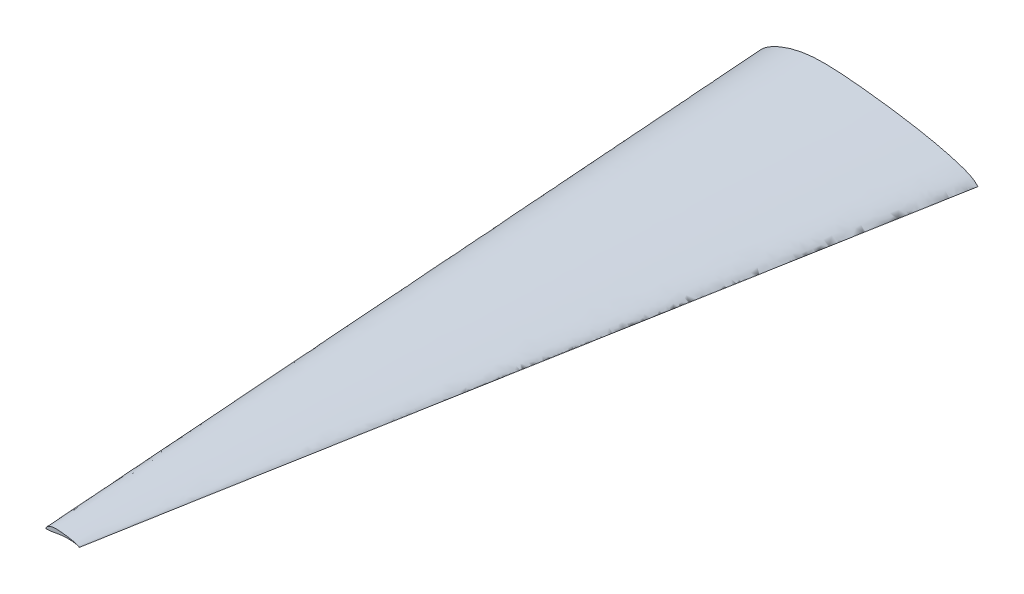
ISO-10303-21;
HEADER;
FILE_DESCRIPTION(('STEP AP214'),'2;1');
FILE_NAME('part.step','',(''),(''),'','','');
FILE_SCHEMA(('AUTOMOTIVE_DESIGN { 1 0 10303 214 1 1 1 1 }'));
ENDSEC;
DATA;
#1=APPLICATION_CONTEXT('core data for automotive mechanical design processes');
#2=APPLICATION_PROTOCOL_DEFINITION('international standard','automotive_design',2000,#1);
#3=PRODUCT_CONTEXT('',#1,'mechanical');
#4=PRODUCT('Part','Part','',(#3));
#5=PRODUCT_RELATED_PRODUCT_CATEGORY('part','',(#4));
#6=PRODUCT_DEFINITION_FORMATION('','',#4);
#7=PRODUCT_DEFINITION_CONTEXT('part definition',#1,'design');
#8=PRODUCT_DEFINITION('design','',#6,#7);
#9=PRODUCT_DEFINITION_SHAPE('','',#8);
#10=(LENGTH_UNIT() NAMED_UNIT(*) SI_UNIT(.MILLI.,.METRE.));
#11=(NAMED_UNIT(*) PLANE_ANGLE_UNIT() SI_UNIT($,.RADIAN.));
#12=(NAMED_UNIT(*) SI_UNIT($,.STERADIAN.) SOLID_ANGLE_UNIT());
#13=UNCERTAINTY_MEASURE_WITH_UNIT(LENGTH_MEASURE(1.E-05),#10,'distance_accuracy_value','');
#14=(GEOMETRIC_REPRESENTATION_CONTEXT(3) GLOBAL_UNCERTAINTY_ASSIGNED_CONTEXT((#13)) GLOBAL_UNIT_ASSIGNED_CONTEXT((#10,
#11,#12)) REPRESENTATION_CONTEXT('',''));
#15=CARTESIAN_POINT('',(0.,0.,0.));
#16=DIRECTION('',(0.,0.,1.));
#17=DIRECTION('',(1.,0.,0.));
#18=AXIS2_PLACEMENT_3D('',#15,#16,#17);
#19=CARTESIAN_POINT('',(61.3934433000788,15.0486940580988,700.));
#20=DIRECTION('',(0.,0.,-1.));
#21=DIRECTION('',(-1.,0.,0.));
#22=AXIS2_PLACEMENT_3D('',#19,#20,#21);
#23=PLANE('',#22);
#24=CARTESIAN_POINT('',(91.2130363063145,14.3931086109647,700.));
#25=CARTESIAN_POINT('',(91.21324777082,14.3937070477248,700.));
#26=CARTESIAN_POINT('',(91.1171588872662,14.4696717822711,700.));
#27=CARTESIAN_POINT('',(91.0299092592579,14.5466823701955,700.));
#28=CARTESIAN_POINT('',(90.8486599818489,14.7219848845493,700.));
#29=CARTESIAN_POINT('',(90.6287953381051,14.9033517737532,700.));
#30=CARTESIAN_POINT('',(90.3283270334837,15.0850215864156,700.));
#31=CARTESIAN_POINT('',(89.9556877544935,15.2609337907924,700.));
#32=CARTESIAN_POINT('',(89.5088815975822,15.4506157570831,700.));
#33=CARTESIAN_POINT('',(88.9834398649207,15.6400599648775,700.));
#34=CARTESIAN_POINT('',(88.3845527383798,15.833236344916,700.));
#35=CARTESIAN_POINT('',(87.715646345206,16.0313913324226,700.));
#36=CARTESIAN_POINT('',(86.9789001928267,16.2273748299646,700.));
#37=CARTESIAN_POINT('',(86.179025110034,16.425511204437,700.));
#38=CARTESIAN_POINT('',(85.3204682047619,16.6187060146178,700.));
#39=CARTESIAN_POINT('',(84.4092635510915,16.8101261846433,700.));
#40=CARTESIAN_POINT('',(83.4503830897707,16.9992179800215,700.));
#41=CARTESIAN_POINT('',(82.4492800856243,17.1812234875692,700.));
#42=CARTESIAN_POINT('',(81.4121564138775,17.355098747034,700.));
#43=CARTESIAN_POINT('',(80.3456655365122,17.5183064209802,700.));
#44=CARTESIAN_POINT('',(79.2570432271937,17.6782961809319,700.));
#45=CARTESIAN_POINT('',(78.1509003149223,17.8249886571486,700.));
#46=CARTESIAN_POINT('',(77.0374604534816,17.957733892098,700.));
#47=CARTESIAN_POINT('',(75.9246712186239,18.0849672558104,700.));
#48=CARTESIAN_POINT('',(74.8226331592671,18.1981955445727,700.));
#49=CARTESIAN_POINT('',(73.738830821218,18.2987015892319,700.));
#50=CARTESIAN_POINT('',(72.6827125020195,18.3765087647998,700.));
#51=CARTESIAN_POINT('',(71.6596105486563,18.4329230127722,700.));
#52=CARTESIAN_POINT('',(70.6751912426618,18.4560187789267,700.));
#53=CARTESIAN_POINT('',(69.7334387576005,18.4542650550733,700.));
#54=CARTESIAN_POINT('',(68.8370947860287,18.4073051855507,700.));
#55=CARTESIAN_POINT('',(67.9857147493561,18.3149993582483,700.));
#56=CARTESIAN_POINT('',(67.1773613447071,18.1781383929118,700.));
#57=CARTESIAN_POINT('',(66.4080599539051,18.0113957671084,700.));
#58=CARTESIAN_POINT('',(65.6811806153164,17.8112677307867,700.));
#59=CARTESIAN_POINT('',(64.9999810083022,17.5827973026956,700.));
#60=CARTESIAN_POINT('',(64.3676012105334,17.3356291742643,700.));
#61=CARTESIAN_POINT('',(63.7869425784885,17.0683337380131,700.));
#62=CARTESIAN_POINT('',(63.2604886925574,16.7872106804332,700.));
#63=CARTESIAN_POINT('',(62.7873782092871,16.4997930468596,700.));
#64=CARTESIAN_POINT('',(62.3802884168521,16.1966082171176,700.));
#65=CARTESIAN_POINT('',(62.0251940036743,15.9029263051531,700.));
#66=CARTESIAN_POINT('',(61.7434126632163,15.5954921326688,700.));
#67=CARTESIAN_POINT('',(61.5226604596598,15.2934807777064,700.));
#68=CARTESIAN_POINT('',(61.3606734659826,14.9977272468341,700.));
#69=CARTESIAN_POINT('',(61.2571235164279,14.7177640574113,700.));
#70=CARTESIAN_POINT('',(61.2085942817225,14.4592372482548,700.));
#71=CARTESIAN_POINT('',(61.2136576100944,14.2404123937173,700.));
#72=CARTESIAN_POINT('',(61.2710954743862,14.0390418648149,700.));
#73=CARTESIAN_POINT('',(61.4811417251508,13.9388468126618,700.));
#74=CARTESIAN_POINT('',(61.7638598062999,13.9259248086177,700.));
#75=CARTESIAN_POINT('',(62.1492216474276,13.9140862923358,700.));
#76=CARTESIAN_POINT('',(62.6335099169167,13.9331206717004,700.));
#77=CARTESIAN_POINT('',(63.2115853434654,13.9732883752448,700.));
#78=CARTESIAN_POINT('',(63.8766373579095,14.033970804828,700.));
#79=CARTESIAN_POINT('',(64.6233641712983,14.113224970745,700.));
#80=CARTESIAN_POINT('',(65.445502545613,14.2261194531111,700.));
#81=CARTESIAN_POINT('',(66.3467107739547,14.3680059621522,700.));
#82=CARTESIAN_POINT('',(67.3254841756791,14.5631362149076,700.));
#83=CARTESIAN_POINT('',(68.3922781552565,14.7597764383632,700.));
#84=CARTESIAN_POINT('',(69.537606817334,14.9799390723251,700.));
#85=CARTESIAN_POINT('',(70.7580442827832,15.1928994907078,700.));
#86=CARTESIAN_POINT('',(72.0420760142901,15.40858636786,700.));
#87=CARTESIAN_POINT('',(73.3814976953576,15.6042486409381,700.));
#88=CARTESIAN_POINT('',(74.7632035123,15.7853629438472,700.));
#89=CARTESIAN_POINT('',(76.175368059046,15.9385621080666,700.));
#90=CARTESIAN_POINT('',(77.6048720601698,16.0573000686217,700.));
#91=CARTESIAN_POINT('',(79.0371098437612,16.1451188464664,700.));
#92=CARTESIAN_POINT('',(80.4566309540897,16.1949760026972,700.));
#93=CARTESIAN_POINT('',(81.8482672054234,16.1961684310942,700.));
#94=CARTESIAN_POINT('',(83.1969841814247,16.1626215170868,700.));
#95=CARTESIAN_POINT('',(84.4877618893221,16.0852425670223,700.));
#96=CARTESIAN_POINT('',(85.7045998556663,15.9697989559649,700.));
#97=CARTESIAN_POINT('',(86.8328915309451,15.8193069435203,700.));
#98=CARTESIAN_POINT('',(87.857419113313,15.6345353310308,700.));
#99=CARTESIAN_POINT('',(88.7672630779213,15.4289953676254,700.));
#100=CARTESIAN_POINT('',(89.5431344271245,15.2023916547079,700.));
#101=CARTESIAN_POINT('',(90.1790092083944,14.9650882335364,700.));
#102=CARTESIAN_POINT('',(90.6353606447999,14.7516190363574,700.));
#103=CARTESIAN_POINT('',(90.9675691512524,14.5466954302776,700.));
#104=CARTESIAN_POINT('',(91.10010370813,14.4751358731456,700.));
#105=CARTESIAN_POINT('',(91.2128228608335,14.3925045681171,700.));
#106=CARTESIAN_POINT('',(91.2130363063145,14.3931086109647,700.));
#107=B_SPLINE_CURVE_WITH_KNOTS('',3,(#24,#25,#26,#27,#28,#29,#30,#31,#32,#33,#34,#35,#36,#37,
#38,#39,#40,#41,#42,#43,#44,#45,#46,#47,#48,#49,#50,#51,#52,#53,#54,#55,#56,#57,#58,#59,#60,#61,
#62,#63,#64,#65,#66,#67,#68,#69,#70,#71,#72,#73,#74,#75,#76,#77,#78,#79,#80,#81,#82,#83,#84,#85,
#86,#87,#88,#89,#90,#91,#92,#93,#94,#95,#96,#97,#98,#99,#100,#101,#102,#103,#104,#105,#106),
.UNSPECIFIED.,.T.,.F.,(4,1,1,1,1,1,1,1,1,1,1,1,1,1,1,1,1,1,1,1,1,1,1,1,1,1,1,1,1,1,1,1,1,1,1,1,
1,1,1,1,1,1,1,1,1,1,1,1,1,1,1,1,1,1,1,1,1,1,1,1,1,1,1,1,1,1,1,1,1,1,1,1,1,1,1,1,1,1,1,1,4),(0.,
0.000984069325414273,0.00362460441285257,0.00747484846823752,0.0120895553210187,
0.0175339949488162,0.0240666319187167,0.0317886904802936,0.0406833093178445,0.050721724418448,
0.0618229172496511,0.0739808538187179,0.0871095422898935,0.101156268909517,0.115985611118648,
0.131553824220598,0.147807781532484,0.164554316989685,0.181749362175214,0.19930789210954,
0.21707649580762,0.235010523017403,0.252833096127389,0.270540232696237,0.287891726811076,
0.304787604936839,0.321087687949416,0.336796939095176,0.351785836500767,0.366031168488221,
0.37962080182412,0.392639778004625,0.405148734367625,0.417181016306218,0.428607891605006,
0.43943107534858,0.449576174007455,0.459100587185074,0.46790987501459,0.475967799267961,
0.483314707132192,0.489868412405075,0.495817042410486,0.501135302922927,0.505906830544316,
0.510026945807495,0.51356219104174,0.516434198178689,0.519365104277622,0.523841204129446,
0.530000603275034,0.537737254159107,0.546970863894384,0.557658354601414,0.569613885695174,
0.582811814219211,0.59726713511665,0.613154365316021,0.630446138101288,0.64904864676311,
0.668825200026368,0.689581805144608,0.711197624688015,0.733436105811787,0.75609787094023,
0.778994652400443,0.801901283715063,0.824587970773231,0.846784505909869,0.868320327703238,
0.88897889114578,0.908495771545624,0.926655548522684,0.943293768335217,0.95818475087465,
0.971128514080188,0.981944748207558,0.990270942155145,0.995854435753888,0.999006712025269,1.),.UNSPECIFIED.);
#108=CARTESIAN_POINT('',(91.2130363063145,14.3931086109647,700.));
#109=VERTEX_POINT('',#108);
#110=EDGE_CURVE('E11',#109,#109,#107,.T.);
#111=ORIENTED_EDGE('',*,*,#110,.T.);
#112=EDGE_LOOP('',(#111));
#113=FACE_BOUND('',#112,.T.);
#114=ADVANCED_FACE('F47',(#113),#23,.F.);
#115=CARTESIAN_POINT('',(1.20271329176225,4.37056964756087,0.));
#116=DIRECTION('',(0.,0.,-1.));
#117=DIRECTION('',(-1.,0.,0.));
#118=AXIS2_PLACEMENT_3D('',#115,#116,#117);
#119=PLANE('',#118);
#120=CARTESIAN_POINT('',(200.,0.,0.));
#121=CARTESIAN_POINT('',(200.00140976337,0.00398957840104458,0.));
#122=CARTESIAN_POINT('',(199.360817206345,0.510421142043144,0.));
#123=CARTESIAN_POINT('',(198.779153019623,1.02382506153895,0.));
#124=CARTESIAN_POINT('',(197.570824503563,2.19250849056445,0.));
#125=CARTESIAN_POINT('',(196.105060211938,3.40162108525687,0.));
#126=CARTESIAN_POINT('',(194.101938181129,4.61275316967255,0.));
#127=CARTESIAN_POINT('',(191.617676321194,5.78550119885138,0.));
#128=CARTESIAN_POINT('',(188.638968608452,7.05004764078961,0.));
#129=CARTESIAN_POINT('',(185.136023724041,8.31300902608562,0.));
#130=CARTESIAN_POINT('',(181.143442880436,9.60085155967541,0.));
#131=CARTESIAN_POINT('',(176.684066925944,10.9218848097193,0.));
#132=CARTESIAN_POINT('',(171.772425910082,12.2284414599994,0.));
#133=CARTESIAN_POINT('',(166.43992535813,13.5493506231488,0.));
#134=CARTESIAN_POINT('',(160.716212656316,14.8373160243538,0.));
#135=CARTESIAN_POINT('',(154.64151496518,16.1134504911911,0.));
#136=CARTESIAN_POINT('',(148.248978556375,17.3740624603791,0.));
#137=CARTESIAN_POINT('',(141.574958528732,18.587432510697,0.));
#138=CARTESIAN_POINT('',(134.660800717087,19.7466009071288,0.));
#139=CARTESIAN_POINT('',(127.550861534652,20.8346520667699,0.));
#140=CARTESIAN_POINT('',(120.293379472528,21.9012504664484,0.));
#141=CARTESIAN_POINT('',(112.919093390719,22.8792003078925,0.));
#142=CARTESIAN_POINT('',(105.496160981114,23.764168540889,0.));
#143=CARTESIAN_POINT('',(98.0775660820632,24.6123909656379,0.));
#144=CARTESIAN_POINT('',(90.7306456863513,25.3672462240534,0.));
#145=CARTESIAN_POINT('',(83.5052967660236,26.0372865217814,0.));
#146=CARTESIAN_POINT('',(76.464507971367,26.5560010255673,0.));
#147=CARTESIAN_POINT('',(69.643828282279,26.9320960120501,0.));
#148=CARTESIAN_POINT('',(63.0810329089826,27.0860677864131,0.));
#149=CARTESIAN_POINT('',(56.8026830085738,27.0743762940575,0.));
#150=CARTESIAN_POINT('',(50.8270565314283,26.7613104972403,0.));
#151=CARTESIAN_POINT('',(45.1511896202776,26.1459383152241,0.));
#152=CARTESIAN_POINT('',(39.762166922618,25.2335318796476,0.));
#153=CARTESIAN_POINT('',(34.6334909839375,24.1219143742914,0.));
#154=CARTESIAN_POINT('',(29.7876287266793,22.7877274654803,0.));
#155=CARTESIAN_POINT('',(25.2462980132514,21.264591278206,0.));
#156=CARTESIAN_POINT('',(21.0304326947931,19.6168037553305,0.));
#157=CARTESIAN_POINT('',(17.1593751478271,17.8348341803229,0.));
#158=CARTESIAN_POINT('',(13.6496825749533,15.9606804631237,0.));
#159=CARTESIAN_POINT('',(10.4956126864845,14.0445629059659,0.));
#160=CARTESIAN_POINT('',(7.78168073691762,12.0233307076863,0.));
#161=CARTESIAN_POINT('',(5.41438464906599,10.0654512945894,0.));
#162=CARTESIAN_POINT('',(3.53584237934547,8.0158901446942,0.));
#163=CARTESIAN_POINT('',(2.06416102230251,6.00248111161142,0.));
#164=CARTESIAN_POINT('',(0.984247731120862,4.03079090579629,0.));
#165=CARTESIAN_POINT('',(0.293914734089971,2.16436964297742,0.));
#166=CARTESIAN_POINT('',(-0.0296134972796619,0.440857581933844,0.));
#167=CARTESIAN_POINT('',(0.00414202519993184,-1.01797478164939,0.));
#168=CARTESIAN_POINT('',(0.387061120478284,-2.36044497433198,0.));
#169=CARTESIAN_POINT('',(1.78736945890929,-3.02841198868592,0.));
#170=CARTESIAN_POINT('',(3.67215666656998,-3.11455868231303,0.));
#171=CARTESIAN_POINT('',(6.24123560742074,-3.19348212419229,0.));
#172=CARTESIAN_POINT('',(9.46982407068137,-3.06658626176198,0.));
#173=CARTESIAN_POINT('',(13.3236602476728,-2.79880157146587,0.));
#174=CARTESIAN_POINT('',(17.7573403439669,-2.39425204091121,0.));
#175=CARTESIAN_POINT('',(22.7355190998924,-1.86589093479815,0.));
#176=CARTESIAN_POINT('',(28.216441595324,-1.1132610523572,0.));
#177=CARTESIAN_POINT('',(34.224496450935,-0.167350992083212,0.));
#178=CARTESIAN_POINT('',(40.7496524624311,1.13351735961941,0.));
#179=CARTESIAN_POINT('',(47.8616123262806,2.44445218265715,0.));
#180=CARTESIAN_POINT('',(55.4971367401303,3.9122030757362,0.));
#181=CARTESIAN_POINT('',(63.6333865097914,5.33193919828737,0.));
#182=CARTESIAN_POINT('',(72.1935980531712,6.76985171263529,0.));
#183=CARTESIAN_POINT('',(81.1230759269542,8.07426686648972,0.));
#184=CARTESIAN_POINT('',(90.3344480399034,9.28169555254991,0.));
#185=CARTESIAN_POINT('',(99.7488783515434,10.3030233140128,0.));
#186=CARTESIAN_POINT('',(109.278905025702,11.0946097177133,0.));
#187=CARTESIAN_POINT('',(118.827156916312,11.6800682366783,0.));
#188=CARTESIAN_POINT('',(128.290630985169,12.012449278217,0.));
#189=CARTESIAN_POINT('',(137.56820599406,12.0203988008638,0.));
#190=CARTESIAN_POINT('',(146.559652500735,11.7967527074806,0.));
#191=CARTESIAN_POINT('',(155.164837220051,11.2808930403844,0.));
#192=CARTESIAN_POINT('',(163.277090329012,10.5112689666682,0.));
#193=CARTESIAN_POINT('',(170.799034830871,9.50798888370421,0.));
#194=CARTESIAN_POINT('',(177.629218713324,8.27617813377405,0.));
#195=CARTESIAN_POINT('',(183.694845144046,6.90591171107133,0.));
#196=CARTESIAN_POINT('',(188.8673208054,5.39522029162144,0.));
#197=CARTESIAN_POINT('',(193.106486013866,3.81319748381123,0.));
#198=CARTESIAN_POINT('',(196.148828923236,2.39006950261799,0.));
#199=CARTESIAN_POINT('',(198.363552299586,1.02391212875292,0.));
#200=CARTESIAN_POINT('',(199.247116012103,0.546848414539277,0.));
#201=CARTESIAN_POINT('',(199.998577030127,-0.00402695231694919,0.));
#202=CARTESIAN_POINT('',(200.,0.,0.));
#203=B_SPLINE_CURVE_WITH_KNOTS('',3,(#120,#121,#122,#123,#124,#125,#126,#127,#128,#129,#130,
#131,#132,#133,#134,#135,#136,#137,#138,#139,#140,#141,#142,#143,#144,#145,#146,#147,#148,#149,
#150,#151,#152,#153,#154,#155,#156,#157,#158,#159,#160,#161,#162,#163,#164,#165,#166,#167,#168,
#169,#170,#171,#172,#173,#174,#175,#176,#177,#178,#179,#180,#181,#182,#183,#184,#185,#186,#187,
#188,#189,#190,#191,#192,#193,#194,#195,#196,#197,#198,#199,#200,#201,#202),.UNSPECIFIED.,.T.,
.F.,(4,1,1,1,1,1,1,1,1,1,1,1,1,1,1,1,1,1,1,1,1,1,1,1,1,1,1,1,1,1,1,1,1,1,1,1,1,1,1,1,1,1,1,1,1,
1,1,1,1,1,1,1,1,1,1,1,1,1,1,1,1,1,1,1,1,1,1,1,1,1,1,1,1,1,1,1,1,1,1,1,4),(0.,
0.000984069325414273,0.00362460441285257,0.00747484846823752,0.0120895553210187,
0.0175339949488162,0.0240666319187167,0.0317886904802936,0.0406833093178445,0.050721724418448,
0.0618229172496511,0.0739808538187179,0.0871095422898935,0.101156268909517,0.115985611118648,
0.131553824220598,0.147807781532484,0.164554316989685,0.181749362175214,0.19930789210954,
0.21707649580762,0.235010523017403,0.252833096127389,0.270540232696237,0.287891726811076,
0.304787604936839,0.321087687949416,0.336796939095176,0.351785836500767,0.366031168488221,
0.37962080182412,0.392639778004625,0.405148734367625,0.417181016306218,0.428607891605006,
0.43943107534858,0.449576174007455,0.459100587185074,0.46790987501459,0.475967799267961,
0.483314707132192,0.489868412405075,0.495817042410486,0.501135302922927,0.505906830544316,
0.510026945807495,0.51356219104174,0.516434198178689,0.519365104277622,0.523841204129446,
0.530000603275034,0.537737254159107,0.546970863894384,0.557658354601414,0.569613885695174,
0.582811814219211,0.59726713511665,0.613154365316021,0.630446138101288,0.64904864676311,
0.668825200026368,0.689581805144608,0.711197624688015,0.733436105811787,0.75609787094023,
0.778994652400443,0.801901283715063,0.824587970773231,0.846784505909869,0.868320327703238,
0.88897889114578,0.908495771545624,0.926655548522684,0.943293768335217,0.95818475087465,
0.971128514080188,0.981944748207558,0.990270942155145,0.995854435753888,0.999006712025269,1.),.UNSPECIFIED.);
#204=CARTESIAN_POINT('',(200.,0.,0.));
#205=VERTEX_POINT('',#204);
#206=EDGE_CURVE('E57',#205,#205,#203,.T.);
#207=ORIENTED_EDGE('',*,*,#206,.F.);
#208=EDGE_LOOP('',(#207));
#209=FACE_BOUND('',#208,.T.);
#210=ADVANCED_FACE('F85',(#209),#119,.T.);
#211=CARTESIAN_POINT('',(0.365556474131087,-2.01566691091643,0.));
#212=CARTESIAN_POINT('',(61.2193100720595,14.2645392880292,700.));
#213=CARTESIAN_POINT('',(0.407839734051821,-2.09059734356018,0.));
#214=CARTESIAN_POINT('',(61.2208910206036,14.2514370421515,700.));
#215=CARTESIAN_POINT('',(0.458597361293128,-2.1661301890592,0.));
#216=CARTESIAN_POINT('',(61.2229150966544,14.2374505165738,700.));
#217=CARTESIAN_POINT('',(0.764211764323133,-2.53406198353965,0.));
#218=CARTESIAN_POINT('',(61.2356485520285,14.1633146871273,700.));
#219=CARTESIAN_POINT('',(1.16411702152294,-2.73111170248164,0.));
#220=CARTESIAN_POINT('',(61.2542148461988,14.099491149684,700.));
#221=CARTESIAN_POINT('',(1.95514728916004,-2.97641309916418,0.));
#222=CARTESIAN_POINT('',(61.3318045452048,14.0100827736876,700.));
#223=CARTESIAN_POINT('',(2.5880126874233,-3.06500644700518,0.));
#224=CARTESIAN_POINT('',(61.4253171584128,13.9660250257584,700.));
#225=CARTESIAN_POINT('',(3.60509159952578,-3.10741547885142,0.));
#226=CARTESIAN_POINT('',(61.5764829074494,13.9344891177516,700.));
#227=CARTESIAN_POINT('',(4.69408843562274,-3.14595295801898,0.));
#228=CARTESIAN_POINT('',(61.7392682661551,13.9274279803402,700.));
#229=CARTESIAN_POINT('',(5.95094894153947,-3.16665329831216,0.));
#230=CARTESIAN_POINT('',(61.9275407598012,13.920896444555,700.));
#231=CARTESIAN_POINT('',(7.49631352842752,-3.14415276648203,0.));
#232=CARTESIAN_POINT('',(62.1595138847883,13.917654398297,700.));
#233=CARTESIAN_POINT('',(8.97112007172186,-3.07877003355681,0.));
#234=CARTESIAN_POINT('',(62.3808804800977,13.9231913695842,700.));
#235=CARTESIAN_POINT('',(10.9424617389554,-2.96425969576223,0.));
#236=CARTESIAN_POINT('',(62.6767560831729,13.9373980544448,700.));
#237=CARTESIAN_POINT('',(12.6232546153333,-2.84227821376786,0.));
#238=CARTESIAN_POINT('',(62.9290141083511,13.9536538481901,700.));
#239=CARTESIAN_POINT('',(15.0018504469956,-2.64567571606531,0.));
#240=CARTESIAN_POINT('',(63.2859867505901,13.980951191973,700.));
#241=CARTESIAN_POINT('',(16.8819338831208,-2.47063092775345,0.));
#242=CARTESIAN_POINT('',(63.5681205415646,14.0058202999405,700.));
#243=CARTESIAN_POINT('',(19.6351487540702,-2.19495005171494,0.));
#244=CARTESIAN_POINT('',(63.9812457407384,14.045648045976,700.));
#245=CARTESIAN_POINT('',(21.6882177432614,-1.96986270058142,0.));
#246=CARTESIAN_POINT('',(64.2893892957794,14.077778406189,700.));
#247=CARTESIAN_POINT('',(24.7817650820978,-1.58490431725043,0.));
#248=CARTESIAN_POINT('',(64.7538134042727,14.1323105385053,700.));
#249=CARTESIAN_POINT('',(26.9992915801037,-1.27583956740147,0.));
#250=CARTESIAN_POINT('',(65.0866788419077,14.1768464626315,700.));
#251=CARTESIAN_POINT('',(30.4283760190949,-0.765013395770438,0.));
#252=CARTESIAN_POINT('',(65.6013378924406,14.251393661038,700.));
#253=CARTESIAN_POINT('',(32.8121961557572,-0.380438289279744,0.));
#254=CARTESIAN_POINT('',(65.9592569884123,14.3070051153817,700.));
#255=CARTESIAN_POINT('',(36.59258845096,0.304756637424069,0.));
#256=CARTESIAN_POINT('',(66.5270888051045,14.4054824954333,700.));
#257=CARTESIAN_POINT('',(39.1574067279642,0.812784869364103,0.));
#258=CARTESIAN_POINT('',(66.9119879558398,14.4807007689213,700.));
#259=CARTESIAN_POINT('',(43.3206552132522,1.60742569159822,0.));
#260=CARTESIAN_POINT('',(67.5361945371838,14.601445474149,700.));
#261=CARTESIAN_POINT('',(46.084262842406,2.11855653013369,0.));
#262=CARTESIAN_POINT('',(67.9506880331788,14.6783789221197,700.));
#263=CARTESIAN_POINT('',(50.6216850620048,2.97501157887547,0.));
#264=CARTESIAN_POINT('',(68.6314506047755,14.8060269306993,700.));
#265=CARTESIAN_POINT('',(53.5622137788093,3.53640080082807,0.));
#266=CARTESIAN_POINT('',(69.0724759567318,14.8905285486931,700.));
#267=CARTESIAN_POINT('',(58.4462285351526,4.42680529034924,0.));
#268=CARTESIAN_POINT('',(69.8047387553728,15.0259437191634,700.));
#269=CARTESIAN_POINT('',(61.5570908304384,4.96821734003042,0.));
#270=CARTESIAN_POINT('',(70.2712244322671,15.1079517879554,700.));
#271=CARTESIAN_POINT('',(66.7474199033669,5.855022952004,0.));
#272=CARTESIAN_POINT('',(71.0496546274865,15.2416613831053,700.));
#273=CARTESIAN_POINT('',(69.997178787775,6.39613437035021,0.));
#274=CARTESIAN_POINT('',(71.5369707622046,15.3237406652327,700.));
#275=CARTESIAN_POINT('',(75.4536347090481,7.24607678157598,0.));
#276=CARTESIAN_POINT('',(72.3550689719684,15.453569063388,700.));
#277=CARTESIAN_POINT('',(78.8328594599207,7.73643341009386,0.));
#278=CARTESIAN_POINT('',(72.861772044916,15.5283272910154,700.));
#279=CARTESIAN_POINT('',(84.5086934319408,8.51805435497926,0.));
#280=CARTESIAN_POINT('',(73.7129249825548,15.6471887829105,700.));
#281=CARTESIAN_POINT('',(87.9811378702275,8.96826178169618,0.));
#282=CARTESIAN_POINT('',(74.2336339686749,15.7159468513914,700.));
#283=CARTESIAN_POINT('',(93.8157848889768,9.65936959689079,0.));
#284=CARTESIAN_POINT('',(75.1085296714449,15.8220710677687,700.));
#285=CARTESIAN_POINT('',(97.3564279042289,10.0378694859698,0.));
#286=CARTESIAN_POINT('',(75.639455597289,15.880423457422,700.));
#287=CARTESIAN_POINT('',(103.297488936841,10.5977792457004,0.));
#288=CARTESIAN_POINT('',(76.5303492266301,15.9672007547567,700.));
#289=CARTESIAN_POINT('',(106.879155413429,10.890458054458,0.));
#290=CARTESIAN_POINT('',(77.0674678413473,16.0126620117247,700.));
#291=CARTESIAN_POINT('',(112.8657720348,11.3145412686327,0.));
#292=CARTESIAN_POINT('',(77.9652886058042,16.0786767085367,700.));
#293=CARTESIAN_POINT('',(116.454315128418,11.528729669944,0.));
#294=CARTESIAN_POINT('',(78.5034732031444,16.1123984992384,700.));
#295=CARTESIAN_POINT('',(122.420273744031,11.8062675483558,0.));
#296=CARTESIAN_POINT('',(79.3982160222823,16.1569335900655,700.));
#297=CARTESIAN_POINT('',(125.982818832059,11.9236864036968,0.));
#298=CARTESIAN_POINT('',(79.9325328604266,16.1765683577909,700.));
#299=CARTESIAN_POINT('',(131.855143700262,12.0155035434239,0.));
#300=CARTESIAN_POINT('',(80.8133160819738,16.1941484966792,700.));
#301=CARTESIAN_POINT('',(135.351119427058,12.0126757526868,0.));
#302=CARTESIAN_POINT('',(81.337703650697,16.1957309529238,700.));
#303=CARTESIAN_POINT('',(141.063151045773,11.9334683156716,0.));
#304=CARTESIAN_POINT('',(82.1945433800248,16.1867047241304,700.));
#305=CARTESIAN_POINT('',(144.465515001577,11.8408415328,0.));
#306=CARTESIAN_POINT('',(82.7049564147154,16.1748598246582,700.));
#307=CARTESIAN_POINT('',(149.95756695864,11.5930560898889,0.));
#308=CARTESIAN_POINT('',(83.5289193428872,16.1415645296055,700.));
#309=CARTESIAN_POINT('',(153.23252493973,11.3886884166711,0.));
#310=CARTESIAN_POINT('',(84.0203037126602,16.113265535414,700.));
#311=CARTESIAN_POINT('',(158.431498217747,10.9709790238063,0.));
#312=CARTESIAN_POINT('',(84.8004497872271,16.054426495704,700.));
#313=CARTESIAN_POINT('',(161.538427836111,10.667260295796,0.));
#314=CARTESIAN_POINT('',(85.2667239035977,16.0113410367514,700.));
#315=CARTESIAN_POINT('',(166.372136133826,10.0984504712561,0.));
#316=CARTESIAN_POINT('',(85.9922319152175,15.9301670255263,700.));
#317=CARTESIAN_POINT('',(169.277481799134,9.69990466227899,0.));
#318=CARTESIAN_POINT('',(86.4284335393642,15.8732537184863,700.));
#319=CARTESIAN_POINT('',(173.684537691477,8.98759389817815,0.));
#320=CARTESIAN_POINT('',(87.0902950206995,15.7713387034393,700.));
#321=CARTESIAN_POINT('',(176.359018576502,8.4943895173178,0.));
#322=CARTESIAN_POINT('',(87.4919923329297,15.7004393599904,700.));
#323=CARTESIAN_POINT('',(180.284743798801,7.67627688683218,0.));
#324=CARTESIAN_POINT('',(88.0816782689236,15.5823782751187,700.));
#325=CARTESIAN_POINT('',(182.697341684361,7.11529008781067,0.));
#326=CARTESIAN_POINT('',(88.444516840444,15.5019059461649,700.));
#327=CARTESIAN_POINT('',(186.066626985439,6.21320077124604,0.));
#328=CARTESIAN_POINT('',(88.9518662647368,15.3729071069974,700.));
#329=CARTESIAN_POINT('',(188.174611738587,5.57738079135047,0.));
#330=CARTESIAN_POINT('',(89.269162762788,15.2824087818213,700.));
#331=CARTESIAN_POINT('',(190.951583875693,4.61738985743713,0.));
#332=CARTESIAN_POINT('',(89.6869861087203,15.1460580796463,700.));
#333=CARTESIAN_POINT('',(192.736437165936,3.92779855292821,0.));
#334=CARTESIAN_POINT('',(89.9578793887495,15.0476121270299,700.));
#335=CARTESIAN_POINT('',(194.785800813227,3.02765819669094,0.));
#336=CARTESIAN_POINT('',(90.271853685707,14.9185638162442,700.));
#337=CARTESIAN_POINT('',(196.174096520333,2.33428816582804,0.));
#338=CARTESIAN_POINT('',(90.4800409635651,14.8242734974027,700.));
#339=CARTESIAN_POINT('',(197.597215034485,1.49662909050329,0.));
#340=CARTESIAN_POINT('',(90.6889333767725,14.7138582631029,700.));
#341=CARTESIAN_POINT('',(198.583220527401,0.90746754846199,0.));
#342=CARTESIAN_POINT('',(90.8510510721409,14.6185698840656,700.));
#343=CARTESIAN_POINT('',(199.127822002493,0.611258985618595,0.));
#344=CARTESIAN_POINT('',(90.9551269911782,14.5563189067865,700.));
#345=CARTESIAN_POINT('',(199.760468827546,0.170523610257043,0.));
#346=CARTESIAN_POINT('',(91.019459637047,14.5195708876863,700.));
#347=CARTESIAN_POINT('',(200.176957991844,-0.134793120313965,0.));
#348=CARTESIAN_POINT('',(91.054303728121,14.4997183058557,700.));
#349=CARTESIAN_POINT('',(199.676446083036,0.26089525573649,0.));
#350=CARTESIAN_POINT('',(91.1027020176481,14.4699096709233,700.));
#351=CARTESIAN_POINT('',(199.318043532939,0.554530460599907,0.));
#352=CARTESIAN_POINT('',(91.1625770827747,14.4293383635599,700.));
#353=CARTESIAN_POINT('',(199.066396818694,0.772528507300002,0.));
#354=CARTESIAN_POINT('',(91.2343740349072,14.3767059962162,700.));
#355=CARTESIAN_POINT('',(198.89508130081,0.928918040306746,0.));
#356=CARTESIAN_POINT('',(91.1922356735875,14.4103185258636,700.));
#357=CARTESIAN_POINT('',(198.564021541997,1.23567419277827,0.));
#358=CARTESIAN_POINT('',(91.1079072614292,14.4778376984043,700.));
#359=CARTESIAN_POINT('',(198.163103035796,1.61870207217614,0.));
#360=CARTESIAN_POINT('',(91.0629655662228,14.5175053330885,700.));
#361=CARTESIAN_POINT('',(197.464313945275,2.26200366027174,0.));
#362=CARTESIAN_POINT('',(90.9701954202691,14.6044370066062,700.));
#363=CARTESIAN_POINT('',(196.866653197597,2.77338114500734,0.));
#364=CARTESIAN_POINT('',(90.8786098480173,14.6914936926101,700.));
#365=CARTESIAN_POINT('',(196.049741232388,3.39149855043674,0.));
#366=CARTESIAN_POINT('',(90.7596203582033,14.7954338906356,700.));
#367=CARTESIAN_POINT('',(195.20602116668,3.94520006652073,0.));
#368=CARTESIAN_POINT('',(90.6424322829916,14.8869932577611,700.));
#369=CARTESIAN_POINT('',(194.196279283943,4.52299949372626,0.));
#370=CARTESIAN_POINT('',(90.4979155766285,14.9824845853778,700.));
#371=CARTESIAN_POINT('',(193.058194818833,5.10547416291476,0.));
#372=CARTESIAN_POINT('',(90.3306932546007,15.0785893268679,700.));
#373=CARTESIAN_POINT('',(191.872449336546,5.65384878952426,0.));
#374=CARTESIAN_POINT('',(90.1553339054701,15.1666866287412,700.));
#375=CARTESIAN_POINT('',(190.412694011966,6.29705058156346,0.));
#376=CARTESIAN_POINT('',(89.9381158538658,15.2665078409199,700.));
#377=CARTESIAN_POINT('',(189.049729086269,6.86054275650451,0.));
#378=CARTESIAN_POINT('',(89.7352176825422,15.3545296289632,700.));
#379=CARTESIAN_POINT('',(187.251981000067,7.55011596874687,0.));
#380=CARTESIAN_POINT('',(89.467489291317,15.4630712192575,700.));
#381=CARTESIAN_POINT('',(185.708237756799,8.09784450274057,0.));
#382=CARTESIAN_POINT('',(89.2371494644284,15.5485868079109,700.));
#383=CARTESIAN_POINT('',(183.577153196177,8.81583660773847,0.));
#384=CARTESIAN_POINT('',(88.9185827602388,15.6595387218033,700.));
#385=CARTESIAN_POINT('',(181.864524661325,9.36218215853146,0.));
#386=CARTESIAN_POINT('',(88.6623827442371,15.7436198004636,700.));
#387=CARTESIAN_POINT('',(179.419771739977,10.1114671507186,0.));
#388=CARTESIAN_POINT('',(88.2963987487957,15.8583711498277,700.));
#389=CARTESIAN_POINT('',(177.551977720138,10.6578560134141,0.));
#390=CARTESIAN_POINT('',(88.0167755752039,15.9421856387455,700.));
#391=CARTESIAN_POINT('',(174.803359536527,11.4221760034238,0.));
#392=CARTESIAN_POINT('',(87.6052702620593,16.0596445200318,700.));
#393=CARTESIAN_POINT('',(172.779019274675,11.9565095173818,0.));
#394=CARTESIAN_POINT('',(87.3020571171192,16.1414111312425,700.));
#395=CARTESIAN_POINT('',(169.740210552769,12.7318397926982,0.));
#396=CARTESIAN_POINT('',(86.8466821536015,16.2594640171663,700.));
#397=CARTESIAN_POINT('',(167.575238342216,13.2629814261913,0.));
#398=CARTESIAN_POINT('',(86.5222674660245,16.3404869332172,700.));
#399=CARTESIAN_POINT('',(164.265067146817,14.0387431336798,0.));
#400=CARTESIAN_POINT('',(86.0262680262032,16.4590735275388,700.));
#401=CARTESIAN_POINT('',(161.964422355685,14.5530581597184,0.));
#402=CARTESIAN_POINT('',(85.6814574755991,16.5374752269688,700.));
#403=CARTESIAN_POINT('',(158.409208179662,15.3219570842872,0.));
#404=CARTESIAN_POINT('',(85.1484954674032,16.6543037207733,700.));
#405=CARTESIAN_POINT('',(155.994665184252,15.8262866752742,0.));
#406=CARTESIAN_POINT('',(84.7865080118234,16.7308770296663,700.));
#407=CARTESIAN_POINT('',(152.221426906286,16.5906932909862,0.));
#408=CARTESIAN_POINT('',(84.2207890157079,16.8468410335808,700.));
#409=CARTESIAN_POINT('',(149.699460247365,17.0845623210221,0.));
#410=CARTESIAN_POINT('',(83.8426779983853,16.9218571914979,700.));
#411=CARTESIAN_POINT('',(145.720531815125,17.8337466592501,0.));
#412=CARTESIAN_POINT('',(83.2461379407794,17.0358132710431,700.));
#413=CARTESIAN_POINT('',(143.097312939447,18.3074677024591,0.));
#414=CARTESIAN_POINT('',(82.8528347945903,17.1078552334291,700.));
#415=CARTESIAN_POINT('',(138.945973535623,19.0281855860134,0.));
#416=CARTESIAN_POINT('',(82.2303905592392,17.2174304650703,700.));
#417=CARTESIAN_POINT('',(136.248628451521,19.4771023433204,0.));
#418=CARTESIAN_POINT('',(81.8259486105123,17.2857258964142,700.));
#419=CARTESIAN_POINT('',(131.957851347694,20.160239775248,0.));
#420=CARTESIAN_POINT('',(81.1825752398284,17.3897273758784,700.));
#421=CARTESIAN_POINT('',(129.192782086167,20.5820168549648,0.));
#422=CARTESIAN_POINT('',(80.7679231427551,17.4536873199793,700.));
#423=CARTESIAN_POINT('',(124.783536960818,21.2413528944917,0.));
#424=CARTESIAN_POINT('',(80.1066320502201,17.5532273000871,700.));
#425=CARTESIAN_POINT('',(121.965535388403,21.6522539891109,0.));
#426=CARTESIAN_POINT('',(79.6840300071467,17.6155439188825,700.));
#427=CARTESIAN_POINT('',(117.470204131268,22.2756492688172,0.));
#428=CARTESIAN_POINT('',(79.0099458908588,17.7105741296669,700.));
#429=CARTESIAN_POINT('',(114.617573938093,22.6509186613041,0.));
#430=CARTESIAN_POINT('',(78.5821750501532,17.7677946380586,700.));
#431=CARTESIAN_POINT('',(110.062179784112,23.2198039462863,0.));
#432=CARTESIAN_POINT('',(77.8990425814556,17.8545570985396,700.));
#433=CARTESIAN_POINT('',(107.182196268653,23.5620434895155,0.));
#434=CARTESIAN_POINT('',(77.4671201748176,17.9065094994458,700.));
#435=CARTESIAN_POINT('',(102.614680050159,24.0936294125745,0.));
#436=CARTESIAN_POINT('',(76.7820540057567,17.986770201292,700.));
#437=CARTESIAN_POINT('',(99.7483793256728,24.418702985155,0.));
#438=CARTESIAN_POINT('',(76.3521708776212,18.0360880809439,700.));
#439=CARTESIAN_POINT('',(95.2079737048016,24.9072256417763,0.));
#440=CARTESIAN_POINT('',(75.6712454324766,18.1106103183102,700.));
#441=CARTESIAN_POINT('',(92.3541900401649,25.1981264403768,0.));
#442=CARTESIAN_POINT('',(75.2432547850755,18.1549790090798,700.));
#443=CARTESIAN_POINT('',(87.8742540741855,25.6321327378186,0.));
#444=CARTESIAN_POINT('',(74.5713722677294,18.221156032606,700.));
#445=CARTESIAN_POINT('',(85.066954737416,25.8880352038385,0.));
#446=CARTESIAN_POINT('',(74.1503662234228,18.2605379923649,700.));
#447=CARTESIAN_POINT('',(80.6939244909322,26.2444081408446,0.));
#448=CARTESIAN_POINT('',(73.4945831318721,18.316047303781,700.));
#449=CARTESIAN_POINT('',(77.9457179351452,26.4425261371851,0.));
#450=CARTESIAN_POINT('',(73.0824505801081,18.3470589481858,700.));
#451=CARTESIAN_POINT('',(73.7131134556263,26.7077140117176,0.));
#452=CARTESIAN_POINT('',(72.4476972007054,18.3888356052315,700.));
#453=CARTESIAN_POINT('',(71.0445219875005,26.8473733270866,0.));
#454=CARTESIAN_POINT('',(72.0474953704027,18.4115348896758,700.));
#455=CARTESIAN_POINT('',(66.9722396478323,26.9947749802361,0.));
#456=CARTESIAN_POINT('',(71.4367861148383,18.4370636096023,700.));
#457=CARTESIAN_POINT('',(64.3830599803329,27.0494695902826,0.));
#458=CARTESIAN_POINT('',(71.0484656017975,18.4472612736059,700.));
#459=CARTESIAN_POINT('',(60.4909251448154,27.081244508704,0.));
#460=CARTESIAN_POINT('',(70.4646879038461,18.4547547484071,700.));
#461=CARTESIAN_POINT('',(58.0017137877538,27.0644370890692,0.));
#462=CARTESIAN_POINT('',(70.0912797388901,18.4549314236516,700.));
#463=CARTESIAN_POINT('',(54.3159614608942,26.9440958178992,0.));
#464=CARTESIAN_POINT('',(69.5382981898,18.4422899879732,700.));
#465=CARTESIAN_POINT('',(51.9340547872587,26.8057818505442,0.));
#466=CARTESIAN_POINT('',(69.1808150970642,18.425312849428,700.));
#467=CARTESIAN_POINT('',(48.4544908494006,26.5040791449939,0.));
#468=CARTESIAN_POINT('',(68.6584157906535,18.3859736013102,700.));
#469=CARTESIAN_POINT('',(46.1750596342603,26.2422842558594,0.));
#470=CARTESIAN_POINT('',(68.3160428300622,18.3508132198112,700.));
#471=CARTESIAN_POINT('',(42.8888670799999,25.7629082630413,0.));
#472=CARTESIAN_POINT('',(67.8222288018895,18.2851791186169,700.));
#473=CARTESIAN_POINT('',(40.7073051566962,25.3821615022718,0.));
#474=CARTESIAN_POINT('',(67.4943778425978,18.2318119268877,700.));
#475=CARTESIAN_POINT('',(37.5977885324892,24.7644125717701,0.));
#476=CARTESIAN_POINT('',(67.0270293251347,18.1438862861715,700.));
#477=CARTESIAN_POINT('',(35.5062708974107,24.2971138504767,0.));
#478=CARTESIAN_POINT('',(66.7125074228059,18.0773833904127,700.));
#479=CARTESIAN_POINT('',(32.5666559292665,23.5528630628382,0.));
#480=CARTESIAN_POINT('',(66.2701982278587,17.9713809478806,700.));
#481=CARTESIAN_POINT('',(30.5680935997635,22.9883302052366,0.));
#482=CARTESIAN_POINT('',(65.9693381053879,17.8906046847733,700.));
#483=CARTESIAN_POINT('',(27.8185795021447,22.1273196868648,0.));
#484=CARTESIAN_POINT('',(65.5552241060997,17.7669330432124,700.));
#485=CARTESIAN_POINT('',(25.9339558277924,21.4821289601145,0.));
#486=CARTESIAN_POINT('',(65.2713132760853,17.6738005838734,700.));
#487=CARTESIAN_POINT('',(23.3906659012717,20.539310176891,0.));
#488=CARTESIAN_POINT('',(64.8880923558758,17.5371498656848,700.));
#489=CARTESIAN_POINT('',(21.6194778182876,19.8307674109045,0.));
#490=CARTESIAN_POINT('',(64.6209247059401,17.4346416576931,700.));
#491=CARTESIAN_POINT('',(19.2969027994492,18.8188054064581,0.));
#492=CARTESIAN_POINT('',(64.2701954315515,17.2884131150391,700.));
#493=CARTESIAN_POINT('',(17.6563907843517,18.0466644115661,0.));
#494=CARTESIAN_POINT('',(64.0222401614012,17.176648618052,700.));
#495=CARTESIAN_POINT('',(15.5600934063439,16.9808278084214,0.));
#496=CARTESIAN_POINT('',(63.705096243042,17.0221327855982,700.));
#497=CARTESIAN_POINT('',(14.0444207870445,16.1546993496896,0.));
#498=CARTESIAN_POINT('',(63.4756873989169,16.9021254335308,700.));
#499=CARTESIAN_POINT('',(12.1729645577111,15.0635648569813,0.));
#500=CARTESIAN_POINT('',(63.1922905316149,16.7433361800089,700.));
#501=CARTESIAN_POINT('',(10.7962332154918,14.1971234238329,0.));
#502=CARTESIAN_POINT('',(62.982596841882,16.618389610229,700.));
#503=CARTESIAN_POINT('',(9.19085078949947,13.0728263973569,0.));
#504=CARTESIAN_POINT('',(62.7365370325376,16.4574296596021,700.));
#505=CARTESIAN_POINT('',(7.97885663136958,12.1524188332956,0.));
#506=CARTESIAN_POINT('',(62.5514170481599,16.324058243896,700.));
#507=CARTESIAN_POINT('',(6.60766477367437,11.0523572426952,0.));
#508=CARTESIAN_POINT('',(62.3427753224982,16.1629940080973,700.));
#509=CARTESIAN_POINT('',(5.53760716189712,10.1155524790949,0.));
#510=CARTESIAN_POINT('',(62.1769714740245,16.02845432258,700.));
#511=CARTESIAN_POINT('',(4.45104779883626,9.01441410776741,0.));
#512=CARTESIAN_POINT('',(62.0050799397829,15.8728181702745,700.));
#513=CARTESIAN_POINT('',(3.58841424216568,8.02460294075292,0.));
#514=CARTESIAN_POINT('',(61.8680631336699,15.73149054254,700.));
#515=CARTESIAN_POINT('',(2.7607411085771,6.95547316472058,0.));
#516=CARTESIAN_POINT('',(61.7359886869069,15.5775123580473,700.));
#517=CARTESIAN_POINT('',(2.06926717502126,5.94145129215605,0.));
#518=CARTESIAN_POINT('',(61.6236216078939,15.4316058459299,700.));
#519=CARTESIAN_POINT('',(1.47293573998428,4.92303046673454,0.));
#520=CARTESIAN_POINT('',(61.5244719918584,15.2851735065387,700.));
#521=CARTESIAN_POINT('',(0.967051898399218,3.90183333210445,0.));
#522=CARTESIAN_POINT('',(61.4374685998116,15.1379387012734,700.));
#523=CARTESIAN_POINT('',(0.588298995510217,2.9602826984407,0.));
#524=CARTESIAN_POINT('',(61.3691958035753,15.0018463935276,700.));
#525=CARTESIAN_POINT('',(0.273512958864391,1.94379673554769,0.));
#526=CARTESIAN_POINT('',(61.3077847413671,14.8547344584113,700.));
#527=CARTESIAN_POINT('',(0.0959604599655136,1.10982000585833,0.));
#528=CARTESIAN_POINT('',(61.2680973667009,14.7338910922644,700.));
#529=CARTESIAN_POINT('',(-0.00983137523761607,0.145916915512914,0.));
#530=CARTESIAN_POINT('',(61.2334595176123,14.5917002910478,700.));
#531=CARTESIAN_POINT('',(-0.0073218601313432,-0.522533274447678,0.));
#532=CARTESIAN_POINT('',(61.218183197756,14.4913701637769,700.));
#533=CARTESIAN_POINT('',(0.107095374231899,-1.33190823470281,0.));
#534=CARTESIAN_POINT('',(61.2116238065849,14.3719023717991,700.));
#535=CARTESIAN_POINT('',(0.215199272086436,-1.7492179611091,0.));
#536=CARTESIAN_POINT('',(61.2136882964418,14.3111302328704,700.));
#537=CARTESIAN_POINT('',(0.365556474131087,-2.01566691091643,0.));
#538=CARTESIAN_POINT('',(61.2193100720595,14.2645392880292,700.));
#539=B_SPLINE_SURFACE_WITH_KNOTS('',3,1,((#211,#212),(#213,#214),(#215,#216),(#217,#218),(#219,
#220),(#221,#222),(#223,#224),(#225,#226),(#227,#228),(#229,#230),(#231,#232),(#233,#234),(#235,
#236),(#237,#238),(#239,#240),(#241,#242),(#243,#244),(#245,#246),(#247,#248),(#249,#250),(#251,
#252),(#253,#254),(#255,#256),(#257,#258),(#259,#260),(#261,#262),(#263,#264),(#265,#266),(#267,
#268),(#269,#270),(#271,#272),(#273,#274),(#275,#276),(#277,#278),(#279,#280),(#281,#282),(#283,
#284),(#285,#286),(#287,#288),(#289,#290),(#291,#292),(#293,#294),(#295,#296),(#297,#298),(#299,
#300),(#301,#302),(#303,#304),(#305,#306),(#307,#308),(#309,#310),(#311,#312),(#313,#314),(#315,
#316),(#317,#318),(#319,#320),(#321,#322),(#323,#324),(#325,#326),(#327,#328),(#329,#330),(#331,
#332),(#333,#334),(#335,#336),(#337,#338),(#339,#340),(#341,#342),(#343,#344),(#345,#346),(#347,
#348),(#349,#350),(#351,#352),(#353,#354),(#355,#356),(#357,#358),(#359,#360),(#361,#362),(#363,
#364),(#365,#366),(#367,#368),(#369,#370),(#371,#372),(#373,#374),(#375,#376),(#377,#378),(#379,
#380),(#381,#382),(#383,#384),(#385,#386),(#387,#388),(#389,#390),(#391,#392),(#393,#394),(#395,
#396),(#397,#398),(#399,#400),(#401,#402),(#403,#404),(#405,#406),(#407,#408),(#409,#410),(#411,
#412),(#413,#414),(#415,#416),(#417,#418),(#419,#420),(#421,#422),(#423,#424),(#425,#426),(#427,
#428),(#429,#430),(#431,#432),(#433,#434),(#435,#436),(#437,#438),(#439,#440),(#441,#442),(#443,
#444),(#445,#446),(#447,#448),(#449,#450),(#451,#452),(#453,#454),(#455,#456),(#457,#458),(#459,
#460),(#461,#462),(#463,#464),(#465,#466),(#467,#468),(#469,#470),(#471,#472),(#473,#474),(#475,
#476),(#477,#478),(#479,#480),(#481,#482),(#483,#484),(#485,#486),(#487,#488),(#489,#490),(#491,
#492),(#493,#494),(#495,#496),(#497,#498),(#499,#500),(#501,#502),(#503,#504),(#505,#506),(#507,
#508),(#509,#510),(#511,#512),(#513,#514),(#515,#516),(#517,#518),(#519,#520),(#521,#522),(#523,
#524),(#525,#526),(#527,#528),(#529,#530),(#531,#532),(#533,#534),(#535,#536),(#537,#538)),
.UNSPECIFIED.,.T.,.F.,.F.,(4,1,1,1,1,1,1,1,1,1,1,1,1,1,1,1,1,1,1,1,1,1,1,1,1,1,1,1,1,1,1,1,1,1,
1,1,1,1,1,1,1,1,1,1,1,1,1,1,1,1,1,1,1,1,1,1,1,1,1,1,1,1,1,1,1,1,1,1,1,1,1,1,1,1,1,1,1,1,1,1,1,1,
1,1,1,1,1,1,1,1,1,1,1,1,1,1,1,1,1,1,1,1,1,1,1,1,1,1,1,1,1,1,1,1,1,1,1,1,1,1,1,1,1,1,1,1,1,1,1,1,
1,1,1,1,1,1,1,1,1,1,1,1,1,1,1,1,1,1,1,1,1,1,1,1,1,1,1,1,1,1,1,4),(2,2),(0.,0.000621604419411503,
0.000661612255936528,0.0034936115563603,0.00359251835486951,0.00642451765529328,
0.00806861820669336,0.0109006175071171,0.0142280173522812,0.017060016652705,0.0219646682363547,
0.0247966675367784,0.0311982779716314,0.0340302772720552,0.0418857686786617,0.0447177679790854,
0.0538412997724214,0.0566732990728451,0.0670392282964586,0.0698712275968824,0.0814945491938978,
0.0843265484943215,0.0973817793932681,0.100213778693692,0.114673552178535,0.117505551478959,
0.133276060840358,0.136108060140782,0.153052614103616,0.15588461340404,0.173809219221855,
0.176641218522279,0.195425038765263,0.198257038065686,0.217663519889034,0.220495519189458,
0.240325285017478,0.243157284317901,0.26322206647769,0.266054065778114,0.286128697792311,
0.288960697092735,0.308815384850478,0.311647384150902,0.331011919987116,0.33384391928754,
0.352547741780486,0.35537974108091,0.373206305223027,0.376038304523451,0.392723185622871,
0.395555184923295,0.410882962599931,0.413714961900355,0.427521182412464,0.430353181712888,
0.442412164951897,0.445244164252321,0.455355928157435,0.458187927457859,0.466172162284806,
0.469004161585229,0.474498356232393,0.477330355532817,0.480081849831136,0.482913849131559,
0.483234126102516,0.484227414077248,0.485211483402662,0.48606612540294,0.487059413377671,
0.4878520184901,0.488043482703086,0.490684017790524,0.491702262545485,0.494534261845909,
0.496316969398266,0.49914896869869,0.501761409026064,0.504593408326488,0.508294045995964,
0.511126045296388,0.516016104557541,0.518848103857965,0.524910723395092,0.527742722695516,
0.534949138495695,0.537781137796119,0.546050331326899,0.548882330627322,0.558208267895965,
0.561040267196389,0.571336956367141,0.574168955667565,0.585383682986765,0.588215682287188,
0.600213025195896,0.60304502449632,0.615781238297846,0.61861323759827,0.632035195609732,
0.634867194910155,0.648781731066932,0.651613730367356,0.665976776252461,0.668808775552885,
0.683535306186788,0.686367305487212,0.701303909884868,0.704135909185291,0.719237937094651,
0.722069936395075,0.737060510204636,0.73989250950506,0.754767646773484,0.757599646073908,
0.772119140888324,0.774951140188747,0.789015019014086,0.79184701831451,0.805315102026663,
0.808147101327087,0.821024353172424,0.823856352472847,0.836013250578015,0.838845249878438,
0.850258582565468,0.853090581865892,0.863848215901368,0.866680215201792,0.876867192081873,
0.879699191382297,0.889376148444873,0.892208147745297,0.901408430383466,0.90424042968389,
0.912835305682253,0.915667304982677,0.923658489425827,0.926490488726251,0.933803588084702,
0.936635587385126,0.943328001262322,0.946160000562745,0.952137289091837,0.954969288392261,
0.960195213345209,0.963027212645633,0.967542121209439,0.970374120509863,0.974095826482322,
0.976927825782746,0.980044456487734,0.982876455788158,0.985362717000174,0.988194716300598,
0.990134244621564,0.992966243921987,0.994254359884742,0.997086359185166,0.997789605118988,1.),
(0.,1.),.UNSPECIFIED.);
#540=ORIENTED_EDGE('',*,*,#206,.T.);
#541=EDGE_LOOP('',(#540));
#542=FACE_BOUND('',#541,.T.);
#543=ORIENTED_EDGE('',*,*,#110,.F.);
#544=EDGE_LOOP('',(#543));
#545=FACE_BOUND('',#544,.T.);
#546=ADVANCED_FACE('F93',(#542,#545),#539,.T.);
#547=CLOSED_SHELL('',(#114,#210,#546));
#548=MANIFOLD_SOLID_BREP('B2',#547);
#549=ADVANCED_BREP_SHAPE_REPRESENTATION('',(#18,#548),#14);
#550=SHAPE_DEFINITION_REPRESENTATION(#9,#549);
ENDSEC;
END-ISO-10303-21;
